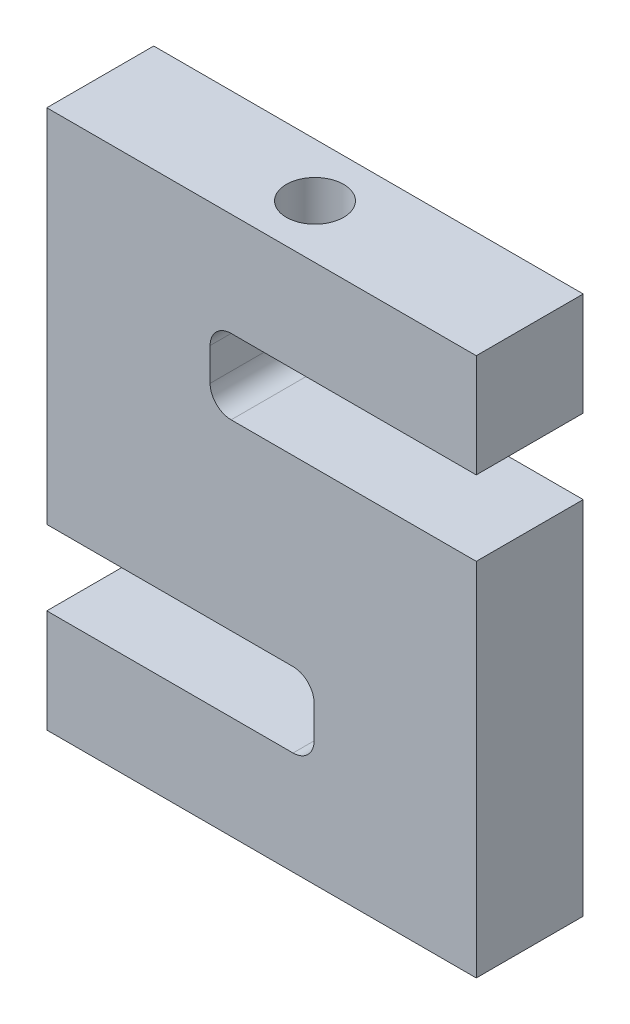
ISO-10303-21;
HEADER;
FILE_DESCRIPTION(('STEP AP214'),'2;1');
FILE_NAME('part.step','',(''),(''),'','','');
FILE_SCHEMA(('AUTOMOTIVE_DESIGN { 1 0 10303 214 1 1 1 1 }'));
ENDSEC;
DATA;
#1=APPLICATION_CONTEXT('core data for automotive mechanical design processes');
#2=APPLICATION_PROTOCOL_DEFINITION('international standard','automotive_design',2000,#1);
#3=PRODUCT_CONTEXT('',#1,'mechanical');
#4=PRODUCT('Part','Part','',(#3));
#5=PRODUCT_RELATED_PRODUCT_CATEGORY('part','',(#4));
#6=PRODUCT_DEFINITION_FORMATION('','',#4);
#7=PRODUCT_DEFINITION_CONTEXT('part definition',#1,'design');
#8=PRODUCT_DEFINITION('design','',#6,#7);
#9=PRODUCT_DEFINITION_SHAPE('','',#8);
#10=(LENGTH_UNIT() NAMED_UNIT(*) SI_UNIT(.MILLI.,.METRE.));
#11=(NAMED_UNIT(*) PLANE_ANGLE_UNIT() SI_UNIT($,.RADIAN.));
#12=(NAMED_UNIT(*) SI_UNIT($,.STERADIAN.) SOLID_ANGLE_UNIT());
#13=UNCERTAINTY_MEASURE_WITH_UNIT(LENGTH_MEASURE(1.E-05),#10,'distance_accuracy_value','');
#14=(GEOMETRIC_REPRESENTATION_CONTEXT(3) GLOBAL_UNCERTAINTY_ASSIGNED_CONTEXT((#13)) GLOBAL_UNIT_ASSIGNED_CONTEXT((#10,
#11,#12)) REPRESENTATION_CONTEXT('',''));
#15=CARTESIAN_POINT('',(0.,0.,0.));
#16=DIRECTION('',(0.,0.,1.));
#17=DIRECTION('',(1.,0.,0.));
#18=AXIS2_PLACEMENT_3D('',#15,#16,#17);
#19=CARTESIAN_POINT('',(3.74241469651418,-17.2389814476984,12.7));
#20=DIRECTION('',(0.,0.,1.));
#21=DIRECTION('',(1.,0.,0.));
#22=AXIS2_PLACEMENT_3D('',#19,#20,#21);
#23=CYLINDRICAL_SURFACE('',#22,2.5);
#24=DIRECTION('',(0.,0.,-1.));
#25=VECTOR('',#24,1.);
#26=CARTESIAN_POINT('',(3.74241469651418,-19.7389814476984,12.7));
#27=LINE('',#26,#25);
#28=CARTESIAN_POINT('',(3.74241469651418,-19.7389814476984,12.7));
#29=VERTEX_POINT('',#28);
#30=CARTESIAN_POINT('',(3.74241469651418,-19.7389814476984,0.));
#31=VERTEX_POINT('',#30);
#32=EDGE_CURVE('E338',#29,#31,#27,.T.);
#33=ORIENTED_EDGE('',*,*,#32,.F.);
#34=CARTESIAN_POINT('',(3.74241469651418,-17.2389814476984,12.7));
#35=DIRECTION('',(0.,0.,-1.));
#36=DIRECTION('',(-1.,0.,0.));
#37=AXIS2_PLACEMENT_3D('',#34,#35,#36);
#38=CIRCLE('',#37,2.5);
#39=CARTESIAN_POINT('',(6.24241469651418,-17.2389814476984,12.7));
#40=VERTEX_POINT('',#39);
#41=EDGE_CURVE('E51',#29,#40,#38,.F.);
#42=ORIENTED_EDGE('',*,*,#41,.T.);
#43=DIRECTION('',(0.,0.,-1.));
#44=VECTOR('',#43,1.);
#45=CARTESIAN_POINT('',(6.24241469651418,-17.2389814476984,12.7));
#46=LINE('',#45,#44);
#47=CARTESIAN_POINT('',(6.24241469651418,-17.2389814476984,0.));
#48=VERTEX_POINT('',#47);
#49=EDGE_CURVE('E342',#48,#40,#46,.F.);
#50=ORIENTED_EDGE('',*,*,#49,.F.);
#51=CARTESIAN_POINT('',(3.74241469651418,-17.2389814476984,0.));
#52=DIRECTION('',(0.,0.,-1.));
#53=DIRECTION('',(-1.,0.,0.));
#54=AXIS2_PLACEMENT_3D('',#51,#52,#53);
#55=CIRCLE('',#54,2.5);
#56=EDGE_CURVE('E11',#48,#31,#55,.T.);
#57=ORIENTED_EDGE('',*,*,#56,.T.);
#58=EDGE_LOOP('',(#33,#42,#50,#57));
#59=FACE_BOUND('',#58,.T.);
#60=ADVANCED_FACE('F43',(#59),#23,.F.);
#61=CARTESIAN_POINT('',(3.74241469651418,-13.3520676357919,12.7));
#62=DIRECTION('',(0.,0.,1.));
#63=DIRECTION('',(1.,0.,0.));
#64=AXIS2_PLACEMENT_3D('',#61,#62,#63);
#65=CYLINDRICAL_SURFACE('',#64,2.5);
#66=DIRECTION('',(0.,0.,-1.));
#67=VECTOR('',#66,1.);
#68=CARTESIAN_POINT('',(6.24241469651418,-13.3520676357919,12.7));
#69=LINE('',#68,#67);
#70=CARTESIAN_POINT('',(6.24241469651418,-13.3520676357919,12.7));
#71=VERTEX_POINT('',#70);
#72=CARTESIAN_POINT('',(6.24241469651418,-13.3520676357919,0.));
#73=VERTEX_POINT('',#72);
#74=EDGE_CURVE('E324',#71,#73,#69,.T.);
#75=ORIENTED_EDGE('',*,*,#74,.F.);
#76=CARTESIAN_POINT('',(3.74241469651418,-13.3520676357919,12.7));
#77=DIRECTION('',(0.,0.,-1.));
#78=DIRECTION('',(-1.,0.,0.));
#79=AXIS2_PLACEMENT_3D('',#76,#77,#78);
#80=CIRCLE('',#79,2.5);
#81=CARTESIAN_POINT('',(3.74241469651418,-10.8520676357919,12.7));
#82=VERTEX_POINT('',#81);
#83=EDGE_CURVE('E332',#71,#82,#80,.F.);
#84=ORIENTED_EDGE('',*,*,#83,.T.);
#85=DIRECTION('',(0.,0.,-1.));
#86=VECTOR('',#85,1.);
#87=CARTESIAN_POINT('',(3.74241469651418,-10.8520676357919,12.7));
#88=LINE('',#87,#86);
#89=CARTESIAN_POINT('',(3.74241469651418,-10.8520676357919,0.));
#90=VERTEX_POINT('',#89);
#91=EDGE_CURVE('E328',#90,#82,#88,.F.);
#92=ORIENTED_EDGE('',*,*,#91,.F.);
#93=CARTESIAN_POINT('',(3.74241469651418,-13.3520676357919,0.));
#94=DIRECTION('',(0.,0.,-1.));
#95=DIRECTION('',(-1.,0.,0.));
#96=AXIS2_PLACEMENT_3D('',#93,#94,#95);
#97=CIRCLE('',#96,2.5);
#98=EDGE_CURVE('E335',#90,#73,#97,.T.);
#99=ORIENTED_EDGE('',*,*,#98,.T.);
#100=EDGE_LOOP('',(#75,#84,#92,#99));
#101=FACE_BOUND('',#100,.T.);
#102=ADVANCED_FACE('F354',(#101),#65,.F.);
#103=CARTESIAN_POINT('',(-3.60618115704416,13.3520676357919,12.7));
#104=DIRECTION('',(0.,0.,1.));
#105=DIRECTION('',(1.,0.,0.));
#106=AXIS2_PLACEMENT_3D('',#103,#104,#105);
#107=CYLINDRICAL_SURFACE('',#106,2.5);
#108=DIRECTION('',(0.,0.,-1.));
#109=VECTOR('',#108,1.);
#110=CARTESIAN_POINT('',(-6.10618115704416,13.3520676357919,12.7));
#111=LINE('',#110,#109);
#112=CARTESIAN_POINT('',(-6.10618115704416,13.3520676357919,12.7));
#113=VERTEX_POINT('',#112);
#114=CARTESIAN_POINT('',(-6.10618115704416,13.3520676357919,0.));
#115=VERTEX_POINT('',#114);
#116=EDGE_CURVE('E310',#113,#115,#111,.T.);
#117=ORIENTED_EDGE('',*,*,#116,.F.);
#118=CARTESIAN_POINT('',(-3.60618115704416,13.3520676357919,12.7));
#119=DIRECTION('',(0.,0.,-1.));
#120=DIRECTION('',(-1.,0.,0.));
#121=AXIS2_PLACEMENT_3D('',#118,#119,#120);
#122=CIRCLE('',#121,2.5);
#123=CARTESIAN_POINT('',(-3.60618115704416,10.8520676357919,12.7));
#124=VERTEX_POINT('',#123);
#125=EDGE_CURVE('E318',#113,#124,#122,.F.);
#126=ORIENTED_EDGE('',*,*,#125,.T.);
#127=DIRECTION('',(0.,0.,-1.));
#128=VECTOR('',#127,1.);
#129=CARTESIAN_POINT('',(-3.60618115704416,10.8520676357919,12.7));
#130=LINE('',#129,#128);
#131=CARTESIAN_POINT('',(-3.60618115704416,10.8520676357919,0.));
#132=VERTEX_POINT('',#131);
#133=EDGE_CURVE('E314',#132,#124,#130,.F.);
#134=ORIENTED_EDGE('',*,*,#133,.F.);
#135=CARTESIAN_POINT('',(-3.60618115704416,13.3520676357919,0.));
#136=DIRECTION('',(0.,0.,-1.));
#137=DIRECTION('',(-1.,0.,0.));
#138=AXIS2_PLACEMENT_3D('',#135,#136,#137);
#139=CIRCLE('',#138,2.5);
#140=EDGE_CURVE('E321',#132,#115,#139,.T.);
#141=ORIENTED_EDGE('',*,*,#140,.T.);
#142=EDGE_LOOP('',(#117,#126,#134,#141));
#143=FACE_BOUND('',#142,.T.);
#144=ADVANCED_FACE('F388',(#143),#107,.F.);
#145=CARTESIAN_POINT('',(-3.60618115704416,17.2389814476984,12.7));
#146=DIRECTION('',(0.,0.,1.));
#147=DIRECTION('',(1.,0.,0.));
#148=AXIS2_PLACEMENT_3D('',#145,#146,#147);
#149=CYLINDRICAL_SURFACE('',#148,2.5);
#150=DIRECTION('',(0.,0.,-1.));
#151=VECTOR('',#150,1.);
#152=CARTESIAN_POINT('',(-3.60618115704416,19.7389814476984,12.7));
#153=LINE('',#152,#151);
#154=CARTESIAN_POINT('',(-3.60618115704416,19.7389814476984,12.7));
#155=VERTEX_POINT('',#154);
#156=CARTESIAN_POINT('',(-3.60618115704416,19.7389814476984,0.));
#157=VERTEX_POINT('',#156);
#158=EDGE_CURVE('E295',#155,#157,#153,.T.);
#159=ORIENTED_EDGE('',*,*,#158,.F.);
#160=CARTESIAN_POINT('',(-3.60618115704416,17.2389814476984,12.7));
#161=DIRECTION('',(0.,0.,-1.));
#162=DIRECTION('',(-1.,0.,0.));
#163=AXIS2_PLACEMENT_3D('',#160,#161,#162);
#164=CIRCLE('',#163,2.5);
#165=CARTESIAN_POINT('',(-6.10618115704416,17.2389814476984,12.7));
#166=VERTEX_POINT('',#165);
#167=EDGE_CURVE('E303',#155,#166,#164,.F.);
#168=ORIENTED_EDGE('',*,*,#167,.T.);
#169=DIRECTION('',(0.,0.,-1.));
#170=VECTOR('',#169,1.);
#171=CARTESIAN_POINT('',(-6.10618115704416,17.2389814476984,12.7));
#172=LINE('',#171,#170);
#173=CARTESIAN_POINT('',(-6.10618115704416,17.2389814476984,0.));
#174=VERTEX_POINT('',#173);
#175=EDGE_CURVE('E299',#174,#166,#172,.F.);
#176=ORIENTED_EDGE('',*,*,#175,.F.);
#177=CARTESIAN_POINT('',(-3.60618115704416,17.2389814476984,0.));
#178=DIRECTION('',(0.,0.,-1.));
#179=DIRECTION('',(-1.,0.,0.));
#180=AXIS2_PLACEMENT_3D('',#177,#178,#179);
#181=CIRCLE('',#180,2.5);
#182=EDGE_CURVE('E307',#174,#157,#181,.T.);
#183=ORIENTED_EDGE('',*,*,#182,.T.);
#184=EDGE_LOOP('',(#159,#168,#176,#183));
#185=FACE_BOUND('',#184,.T.);
#186=ADVANCED_FACE('F382',(#185),#149,.F.);
#187=CARTESIAN_POINT('',(-25.5,32.,12.7));
#188=DIRECTION('',(0.,-1.,0.));
#189=DIRECTION('',(0.,0.,-1.));
#190=AXIS2_PLACEMENT_3D('',#187,#188,#189);
#191=PLANE('',#190);
#192=CARTESIAN_POINT('',(0.,32.,6.35));
#193=DIRECTION('',(0.,1.,0.));
#194=DIRECTION('',(0.,0.,1.));
#195=AXIS2_PLACEMENT_3D('',#192,#193,#194);
#196=CIRCLE('',#195,3.4);
#197=CARTESIAN_POINT('',(0.,32.,9.75));
#198=VERTEX_POINT('',#197);
#199=EDGE_CURVE('E169',#198,#198,#196,.T.);
#200=ORIENTED_EDGE('',*,*,#199,.F.);
#201=EDGE_LOOP('',(#200));
#202=FACE_BOUND('',#201,.T.);
#203=DIRECTION('',(-1.,0.,0.));
#204=VECTOR('',#203,1.);
#205=CARTESIAN_POINT('',(-25.5,32.,0.));
#206=LINE('',#205,#204);
#207=CARTESIAN_POINT('',(25.5,32.,0.));
#208=VERTEX_POINT('',#207);
#209=CARTESIAN_POINT('',(-25.5,32.,0.));
#210=VERTEX_POINT('',#209);
#211=EDGE_CURVE('E183',#208,#210,#206,.T.);
#212=ORIENTED_EDGE('',*,*,#211,.T.);
#213=DIRECTION('',(0.,0.,-1.));
#214=VECTOR('',#213,1.);
#215=CARTESIAN_POINT('',(-25.5,32.,12.7));
#216=LINE('',#215,#214);
#217=CARTESIAN_POINT('',(-25.5,32.,12.7));
#218=VERTEX_POINT('',#217);
#219=EDGE_CURVE('E291',#218,#210,#216,.T.);
#220=ORIENTED_EDGE('',*,*,#219,.F.);
#221=DIRECTION('',(-1.,0.,0.));
#222=VECTOR('',#221,1.);
#223=CARTESIAN_POINT('',(-25.5,32.,12.7));
#224=LINE('',#223,#222);
#225=CARTESIAN_POINT('',(25.5,32.,12.7));
#226=VERTEX_POINT('',#225);
#227=EDGE_CURVE('E184',#226,#218,#224,.T.);
#228=ORIENTED_EDGE('',*,*,#227,.F.);
#229=DIRECTION('',(0.,0.,-1.));
#230=VECTOR('',#229,1.);
#231=CARTESIAN_POINT('',(25.5,32.,12.7));
#232=LINE('',#231,#230);
#233=EDGE_CURVE('E225',#226,#208,#232,.T.);
#234=ORIENTED_EDGE('',*,*,#233,.T.);
#235=EDGE_LOOP('',(#212,#220,#228,#234));
#236=FACE_BOUND('',#235,.T.);
#237=ADVANCED_FACE('F367',(#202,#236),#191,.F.);
#238=CARTESIAN_POINT('',(-25.5,-10.8520676357919,12.7));
#239=DIRECTION('',(1.,0.,0.));
#240=DIRECTION('',(0.,0.,-1.));
#241=AXIS2_PLACEMENT_3D('',#238,#239,#240);
#242=PLANE('',#241);
#243=DIRECTION('',(0.,-1.,0.));
#244=VECTOR('',#243,1.);
#245=CARTESIAN_POINT('',(-25.5,-10.8520676357919,0.));
#246=LINE('',#245,#244);
#247=CARTESIAN_POINT('',(-25.5,-10.8520676357919,0.));
#248=VERTEX_POINT('',#247);
#249=EDGE_CURVE('E229',#210,#248,#246,.T.);
#250=ORIENTED_EDGE('',*,*,#249,.T.);
#251=DIRECTION('',(0.,0.,-1.));
#252=VECTOR('',#251,1.);
#253=CARTESIAN_POINT('',(-25.5,-10.8520676357919,12.7));
#254=LINE('',#253,#252);
#255=CARTESIAN_POINT('',(-25.5,-10.8520676357919,12.7));
#256=VERTEX_POINT('',#255);
#257=EDGE_CURVE('E287',#256,#248,#254,.T.);
#258=ORIENTED_EDGE('',*,*,#257,.F.);
#259=DIRECTION('',(0.,-1.,0.));
#260=VECTOR('',#259,1.);
#261=CARTESIAN_POINT('',(-25.5,-10.8520676357919,12.7));
#262=LINE('',#261,#260);
#263=EDGE_CURVE('E188',#218,#256,#262,.T.);
#264=ORIENTED_EDGE('',*,*,#263,.F.);
#265=ORIENTED_EDGE('',*,*,#219,.T.);
#266=EDGE_LOOP('',(#250,#258,#264,#265));
#267=FACE_BOUND('',#266,.T.);
#268=ADVANCED_FACE('F362',(#267),#242,.F.);
#269=CARTESIAN_POINT('',(6.24241469651418,-10.8520676357919,12.7));
#270=DIRECTION('',(0.,1.,0.));
#271=DIRECTION('',(-1.,0.,0.));
#272=AXIS2_PLACEMENT_3D('',#269,#270,#271);
#273=PLANE('',#272);
#274=DIRECTION('',(1.,0.,0.));
#275=VECTOR('',#274,1.);
#276=CARTESIAN_POINT('',(6.24241469651418,-10.8520676357919,0.));
#277=LINE('',#276,#275);
#278=EDGE_CURVE('E232',#248,#90,#277,.T.);
#279=ORIENTED_EDGE('',*,*,#278,.T.);
#280=ORIENTED_EDGE('',*,*,#91,.T.);
#281=DIRECTION('',(1.,0.,0.));
#282=VECTOR('',#281,1.);
#283=CARTESIAN_POINT('',(6.24241469651418,-10.8520676357919,12.7));
#284=LINE('',#283,#282);
#285=EDGE_CURVE('E192',#256,#82,#284,.T.);
#286=ORIENTED_EDGE('',*,*,#285,.F.);
#287=ORIENTED_EDGE('',*,*,#257,.T.);
#288=EDGE_LOOP('',(#279,#280,#286,#287));
#289=FACE_BOUND('',#288,.T.);
#290=ADVANCED_FACE('F359',(#289),#273,.F.);
#291=CARTESIAN_POINT('',(6.24241469651418,-19.7389814476984,12.7));
#292=DIRECTION('',(1.,0.,0.));
#293=DIRECTION('',(0.,0.,-1.));
#294=AXIS2_PLACEMENT_3D('',#291,#292,#293);
#295=PLANE('',#294);
#296=DIRECTION('',(0.,-1.,0.));
#297=VECTOR('',#296,1.);
#298=CARTESIAN_POINT('',(6.24241469651418,-19.7389814476984,0.));
#299=LINE('',#298,#297);
#300=EDGE_CURVE('E236',#73,#48,#299,.T.);
#301=ORIENTED_EDGE('',*,*,#300,.T.);
#302=ORIENTED_EDGE('',*,*,#49,.T.);
#303=DIRECTION('',(0.,-1.,0.));
#304=VECTOR('',#303,1.);
#305=CARTESIAN_POINT('',(6.24241469651418,-19.7389814476984,12.7));
#306=LINE('',#305,#304);
#307=EDGE_CURVE('E196',#71,#40,#306,.T.);
#308=ORIENTED_EDGE('',*,*,#307,.F.);
#309=ORIENTED_EDGE('',*,*,#74,.T.);
#310=EDGE_LOOP('',(#301,#302,#308,#309));
#311=FACE_BOUND('',#310,.T.);
#312=ADVANCED_FACE('F347',(#311),#295,.F.);
#313=CARTESIAN_POINT('',(-25.5,-19.7389814476984,12.7));
#314=DIRECTION('',(0.,-1.,0.));
#315=DIRECTION('',(0.,0.,-1.));
#316=AXIS2_PLACEMENT_3D('',#313,#314,#315);
#317=PLANE('',#316);
#318=DIRECTION('',(-1.,0.,0.));
#319=VECTOR('',#318,1.);
#320=CARTESIAN_POINT('',(-25.5,-19.7389814476984,12.7));
#321=LINE('',#320,#319);
#322=CARTESIAN_POINT('',(-25.5,-19.7389814476984,12.7));
#323=VERTEX_POINT('',#322);
#324=EDGE_CURVE('E200',#29,#323,#321,.T.);
#325=ORIENTED_EDGE('',*,*,#324,.F.);
#326=ORIENTED_EDGE('',*,*,#32,.T.);
#327=DIRECTION('',(-1.,0.,0.));
#328=VECTOR('',#327,1.);
#329=CARTESIAN_POINT('',(-25.5,-19.7389814476984,0.));
#330=LINE('',#329,#328);
#331=CARTESIAN_POINT('',(-25.5,-19.7389814476984,0.));
#332=VERTEX_POINT('',#331);
#333=EDGE_CURVE('E240',#31,#332,#330,.T.);
#334=ORIENTED_EDGE('',*,*,#333,.T.);
#335=DIRECTION('',(0.,0.,-1.));
#336=VECTOR('',#335,1.);
#337=CARTESIAN_POINT('',(-25.5,-19.7389814476984,12.7));
#338=LINE('',#337,#336);
#339=EDGE_CURVE('E283',#323,#332,#338,.T.);
#340=ORIENTED_EDGE('',*,*,#339,.F.);
#341=EDGE_LOOP('',(#325,#326,#334,#340));
#342=FACE_BOUND('',#341,.T.);
#343=ADVANCED_FACE('F412',(#342),#317,.F.);
#344=CARTESIAN_POINT('',(-25.5,-32.,12.7));
#345=DIRECTION('',(1.,0.,0.));
#346=DIRECTION('',(0.,0.,-1.));
#347=AXIS2_PLACEMENT_3D('',#344,#345,#346);
#348=PLANE('',#347);
#349=DIRECTION('',(0.,-1.,0.));
#350=VECTOR('',#349,1.);
#351=CARTESIAN_POINT('',(-25.5,-32.,0.));
#352=LINE('',#351,#350);
#353=CARTESIAN_POINT('',(-25.5,-32.,0.));
#354=VERTEX_POINT('',#353);
#355=EDGE_CURVE('E243',#332,#354,#352,.T.);
#356=ORIENTED_EDGE('',*,*,#355,.T.);
#357=DIRECTION('',(0.,0.,-1.));
#358=VECTOR('',#357,1.);
#359=CARTESIAN_POINT('',(-25.5,-32.,12.7));
#360=LINE('',#359,#358);
#361=CARTESIAN_POINT('',(-25.5,-32.,12.7));
#362=VERTEX_POINT('',#361);
#363=EDGE_CURVE('E279',#362,#354,#360,.T.);
#364=ORIENTED_EDGE('',*,*,#363,.F.);
#365=DIRECTION('',(0.,-1.,0.));
#366=VECTOR('',#365,1.);
#367=CARTESIAN_POINT('',(-25.5,-32.,12.7));
#368=LINE('',#367,#366);
#369=EDGE_CURVE('E203',#323,#362,#368,.T.);
#370=ORIENTED_EDGE('',*,*,#369,.F.);
#371=ORIENTED_EDGE('',*,*,#339,.T.);
#372=EDGE_LOOP('',(#356,#364,#370,#371));
#373=FACE_BOUND('',#372,.T.);
#374=ADVANCED_FACE('F407',(#373),#348,.F.);
#375=CARTESIAN_POINT('',(25.5,-32.,12.7));
#376=DIRECTION('',(0.,1.,0.));
#377=DIRECTION('',(-1.,0.,0.));
#378=AXIS2_PLACEMENT_3D('',#375,#376,#377);
#379=PLANE('',#378);
#380=CARTESIAN_POINT('',(0.,-32.,6.35));
#381=DIRECTION('',(0.,-1.,0.));
#382=DIRECTION('',(0.,0.,-1.));
#383=AXIS2_PLACEMENT_3D('',#380,#381,#382);
#384=CIRCLE('',#383,3.39999999999999);
#385=CARTESIAN_POINT('',(0.,-32.,2.95000000000001));
#386=VERTEX_POINT('',#385);
#387=EDGE_CURVE('E170',#386,#386,#384,.T.);
#388=ORIENTED_EDGE('',*,*,#387,.F.);
#389=EDGE_LOOP('',(#388));
#390=FACE_BOUND('',#389,.T.);
#391=DIRECTION('',(1.,0.,0.));
#392=VECTOR('',#391,1.);
#393=CARTESIAN_POINT('',(25.5,-32.,0.));
#394=LINE('',#393,#392);
#395=CARTESIAN_POINT('',(25.5,-32.,0.));
#396=VERTEX_POINT('',#395);
#397=EDGE_CURVE('E246',#354,#396,#394,.T.);
#398=ORIENTED_EDGE('',*,*,#397,.T.);
#399=DIRECTION('',(0.,0.,-1.));
#400=VECTOR('',#399,1.);
#401=CARTESIAN_POINT('',(25.5,-32.,12.7));
#402=LINE('',#401,#400);
#403=CARTESIAN_POINT('',(25.5,-32.,12.7));
#404=VERTEX_POINT('',#403);
#405=EDGE_CURVE('E275',#404,#396,#402,.T.);
#406=ORIENTED_EDGE('',*,*,#405,.F.);
#407=DIRECTION('',(1.,0.,0.));
#408=VECTOR('',#407,1.);
#409=CARTESIAN_POINT('',(25.5,-32.,12.7));
#410=LINE('',#409,#408);
#411=EDGE_CURVE('E206',#362,#404,#410,.T.);
#412=ORIENTED_EDGE('',*,*,#411,.F.);
#413=ORIENTED_EDGE('',*,*,#363,.T.);
#414=EDGE_LOOP('',(#398,#406,#412,#413));
#415=FACE_BOUND('',#414,.T.);
#416=ADVANCED_FACE('F403',(#390,#415),#379,.F.);
#417=CARTESIAN_POINT('',(25.5,10.8520676357919,12.7));
#418=DIRECTION('',(-1.,0.,0.));
#419=DIRECTION('',(0.,-1.,0.));
#420=AXIS2_PLACEMENT_3D('',#417,#418,#419);
#421=PLANE('',#420);
#422=DIRECTION('',(0.,1.,0.));
#423=VECTOR('',#422,1.);
#424=CARTESIAN_POINT('',(25.5,10.8520676357919,0.));
#425=LINE('',#424,#423);
#426=CARTESIAN_POINT('',(25.5,10.8520676357919,0.));
#427=VERTEX_POINT('',#426);
#428=EDGE_CURVE('E249',#396,#427,#425,.T.);
#429=ORIENTED_EDGE('',*,*,#428,.T.);
#430=DIRECTION('',(0.,0.,-1.));
#431=VECTOR('',#430,1.);
#432=CARTESIAN_POINT('',(25.5,10.8520676357919,12.7));
#433=LINE('',#432,#431);
#434=CARTESIAN_POINT('',(25.5,10.8520676357919,12.7));
#435=VERTEX_POINT('',#434);
#436=EDGE_CURVE('E271',#435,#427,#433,.T.);
#437=ORIENTED_EDGE('',*,*,#436,.F.);
#438=DIRECTION('',(0.,1.,0.));
#439=VECTOR('',#438,1.);
#440=CARTESIAN_POINT('',(25.5,10.8520676357919,12.7));
#441=LINE('',#440,#439);
#442=EDGE_CURVE('E209',#404,#435,#441,.T.);
#443=ORIENTED_EDGE('',*,*,#442,.F.);
#444=ORIENTED_EDGE('',*,*,#405,.T.);
#445=EDGE_LOOP('',(#429,#437,#443,#444));
#446=FACE_BOUND('',#445,.T.);
#447=ADVANCED_FACE('F399',(#446),#421,.F.);
#448=CARTESIAN_POINT('',(-6.10618115704416,10.8520676357919,12.7));
#449=DIRECTION('',(0.,-1.,0.));
#450=DIRECTION('',(0.,0.,-1.));
#451=AXIS2_PLACEMENT_3D('',#448,#449,#450);
#452=PLANE('',#451);
#453=DIRECTION('',(-1.,0.,0.));
#454=VECTOR('',#453,1.);
#455=CARTESIAN_POINT('',(-6.10618115704416,10.8520676357919,0.));
#456=LINE('',#455,#454);
#457=EDGE_CURVE('E252',#427,#132,#456,.T.);
#458=ORIENTED_EDGE('',*,*,#457,.T.);
#459=ORIENTED_EDGE('',*,*,#133,.T.);
#460=DIRECTION('',(-1.,0.,0.));
#461=VECTOR('',#460,1.);
#462=CARTESIAN_POINT('',(-6.10618115704416,10.8520676357919,12.7));
#463=LINE('',#462,#461);
#464=EDGE_CURVE('E212',#435,#124,#463,.T.);
#465=ORIENTED_EDGE('',*,*,#464,.F.);
#466=ORIENTED_EDGE('',*,*,#436,.T.);
#467=EDGE_LOOP('',(#458,#459,#465,#466));
#468=FACE_BOUND('',#467,.T.);
#469=ADVANCED_FACE('F394',(#468),#452,.F.);
#470=CARTESIAN_POINT('',(-6.10618115704416,19.7389814476984,12.7));
#471=DIRECTION('',(-1.,0.,0.));
#472=DIRECTION('',(0.,-1.,0.));
#473=AXIS2_PLACEMENT_3D('',#470,#471,#472);
#474=PLANE('',#473);
#475=DIRECTION('',(0.,1.,0.));
#476=VECTOR('',#475,1.);
#477=CARTESIAN_POINT('',(-6.10618115704416,19.7389814476984,12.7));
#478=LINE('',#477,#476);
#479=EDGE_CURVE('E216',#113,#166,#478,.T.);
#480=ORIENTED_EDGE('',*,*,#479,.F.);
#481=ORIENTED_EDGE('',*,*,#116,.T.);
#482=DIRECTION('',(0.,1.,0.));
#483=VECTOR('',#482,1.);
#484=CARTESIAN_POINT('',(-6.10618115704416,19.7389814476984,0.));
#485=LINE('',#484,#483);
#486=EDGE_CURVE('E256',#115,#174,#485,.T.);
#487=ORIENTED_EDGE('',*,*,#486,.T.);
#488=ORIENTED_EDGE('',*,*,#175,.T.);
#489=EDGE_LOOP('',(#480,#481,#487,#488));
#490=FACE_BOUND('',#489,.T.);
#491=ADVANCED_FACE('F385',(#490),#474,.F.);
#492=CARTESIAN_POINT('',(25.5,19.7389814476984,12.7));
#493=DIRECTION('',(0.,1.,0.));
#494=DIRECTION('',(-1.,0.,0.));
#495=AXIS2_PLACEMENT_3D('',#492,#493,#494);
#496=PLANE('',#495);
#497=DIRECTION('',(1.,0.,0.));
#498=VECTOR('',#497,1.);
#499=CARTESIAN_POINT('',(25.5,19.7389814476984,12.7));
#500=LINE('',#499,#498);
#501=CARTESIAN_POINT('',(25.5,19.7389814476984,12.7));
#502=VERTEX_POINT('',#501);
#503=EDGE_CURVE('E219',#155,#502,#500,.T.);
#504=ORIENTED_EDGE('',*,*,#503,.F.);
#505=ORIENTED_EDGE('',*,*,#158,.T.);
#506=DIRECTION('',(1.,0.,0.));
#507=VECTOR('',#506,1.);
#508=CARTESIAN_POINT('',(25.5,19.7389814476984,0.));
#509=LINE('',#508,#507);
#510=CARTESIAN_POINT('',(25.5,19.7389814476984,0.));
#511=VERTEX_POINT('',#510);
#512=EDGE_CURVE('E259',#157,#511,#509,.T.);
#513=ORIENTED_EDGE('',*,*,#512,.T.);
#514=DIRECTION('',(0.,0.,-1.));
#515=VECTOR('',#514,1.);
#516=CARTESIAN_POINT('',(25.5,19.7389814476984,12.7));
#517=LINE('',#516,#515);
#518=EDGE_CURVE('E267',#502,#511,#517,.T.);
#519=ORIENTED_EDGE('',*,*,#518,.F.);
#520=EDGE_LOOP('',(#504,#505,#513,#519));
#521=FACE_BOUND('',#520,.T.);
#522=ADVANCED_FACE('F376',(#521),#496,.F.);
#523=CARTESIAN_POINT('',(25.5,32.,12.7));
#524=DIRECTION('',(-1.,0.,0.));
#525=DIRECTION('',(0.,-1.,0.));
#526=AXIS2_PLACEMENT_3D('',#523,#524,#525);
#527=PLANE('',#526);
#528=DIRECTION('',(0.,1.,0.));
#529=VECTOR('',#528,1.);
#530=CARTESIAN_POINT('',(25.5,32.,0.));
#531=LINE('',#530,#529);
#532=EDGE_CURVE('E189',#511,#208,#531,.T.);
#533=ORIENTED_EDGE('',*,*,#532,.T.);
#534=ORIENTED_EDGE('',*,*,#233,.F.);
#535=DIRECTION('',(0.,1.,0.));
#536=VECTOR('',#535,1.);
#537=CARTESIAN_POINT('',(25.5,32.,12.7));
#538=LINE('',#537,#536);
#539=EDGE_CURVE('E222',#502,#226,#538,.T.);
#540=ORIENTED_EDGE('',*,*,#539,.F.);
#541=ORIENTED_EDGE('',*,*,#518,.T.);
#542=EDGE_LOOP('',(#533,#534,#540,#541));
#543=FACE_BOUND('',#542,.T.);
#544=ADVANCED_FACE('F372',(#543),#527,.F.);
#545=CARTESIAN_POINT('',(0.,0.,12.7));
#546=DIRECTION('',(0.,0.,-1.));
#547=DIRECTION('',(-1.,0.,0.));
#548=AXIS2_PLACEMENT_3D('',#545,#546,#547);
#549=PLANE('',#548);
#550=ORIENTED_EDGE('',*,*,#41,.F.);
#551=ORIENTED_EDGE('',*,*,#324,.T.);
#552=ORIENTED_EDGE('',*,*,#369,.T.);
#553=ORIENTED_EDGE('',*,*,#411,.T.);
#554=ORIENTED_EDGE('',*,*,#442,.T.);
#555=ORIENTED_EDGE('',*,*,#464,.T.);
#556=ORIENTED_EDGE('',*,*,#125,.F.);
#557=ORIENTED_EDGE('',*,*,#479,.T.);
#558=ORIENTED_EDGE('',*,*,#167,.F.);
#559=ORIENTED_EDGE('',*,*,#503,.T.);
#560=ORIENTED_EDGE('',*,*,#539,.T.);
#561=ORIENTED_EDGE('',*,*,#227,.T.);
#562=ORIENTED_EDGE('',*,*,#263,.T.);
#563=ORIENTED_EDGE('',*,*,#285,.T.);
#564=ORIENTED_EDGE('',*,*,#83,.F.);
#565=ORIENTED_EDGE('',*,*,#307,.T.);
#566=EDGE_LOOP('',(#550,#551,#552,#553,#554,#555,#556,#557,#558,#559,#560,#561,#562,#563,#564,#565));
#567=FACE_BOUND('',#566,.T.);
#568=ADVANCED_FACE('F349',(#567),#549,.F.);
#569=CARTESIAN_POINT('',(0.,0.,0.));
#570=DIRECTION('',(0.,0.,-1.));
#571=DIRECTION('',(-1.,0.,0.));
#572=AXIS2_PLACEMENT_3D('',#569,#570,#571);
#573=PLANE('',#572);
#574=ORIENTED_EDGE('',*,*,#211,.F.);
#575=ORIENTED_EDGE('',*,*,#532,.F.);
#576=ORIENTED_EDGE('',*,*,#512,.F.);
#577=ORIENTED_EDGE('',*,*,#182,.F.);
#578=ORIENTED_EDGE('',*,*,#486,.F.);
#579=ORIENTED_EDGE('',*,*,#140,.F.);
#580=ORIENTED_EDGE('',*,*,#457,.F.);
#581=ORIENTED_EDGE('',*,*,#428,.F.);
#582=ORIENTED_EDGE('',*,*,#397,.F.);
#583=ORIENTED_EDGE('',*,*,#355,.F.);
#584=ORIENTED_EDGE('',*,*,#333,.F.);
#585=ORIENTED_EDGE('',*,*,#56,.F.);
#586=ORIENTED_EDGE('',*,*,#300,.F.);
#587=ORIENTED_EDGE('',*,*,#98,.F.);
#588=ORIENTED_EDGE('',*,*,#278,.F.);
#589=ORIENTED_EDGE('',*,*,#249,.F.);
#590=EDGE_LOOP('',(#574,#575,#576,#577,#578,#579,#580,#581,#582,#583,#584,#585,#586,#587,#588,#589));
#591=FACE_BOUND('',#590,.T.);
#592=ADVANCED_FACE('F356',(#591),#573,.T.);
#593=CARTESIAN_POINT('',(0.,22.8520676357919,6.35));
#594=DIRECTION('',(0.,1.,0.));
#595=DIRECTION('',(0.,0.,1.));
#596=AXIS2_PLACEMENT_3D('',#593,#594,#595);
#597=CONICAL_SURFACE('',#596,3.4,1.02974425867665);
#598=CARTESIAN_POINT('',(0.,20.8091415310982,6.35));
#599=VERTEX_POINT('',#598);
#600=VERTEX_LOOP('',#599);
#601=FACE_BOUND('',#600,.T.);
#602=CARTESIAN_POINT('',(0.,22.8520676357919,6.35));
#603=DIRECTION('',(0.,1.,0.));
#604=DIRECTION('',(0.,0.,1.));
#605=AXIS2_PLACEMENT_3D('',#602,#603,#604);
#606=CIRCLE('',#605,3.4);
#607=CARTESIAN_POINT('',(0.,22.8520676357919,9.75));
#608=VERTEX_POINT('',#607);
#609=EDGE_CURVE('E175',#608,#608,#606,.T.);
#610=ORIENTED_EDGE('',*,*,#609,.T.);
#611=EDGE_LOOP('',(#610));
#612=FACE_BOUND('',#611,.T.);
#613=ADVANCED_FACE('F452',(#601,#612),#597,.F.);
#614=CARTESIAN_POINT('',(0.,32.,6.35));
#615=DIRECTION('',(0.,1.,0.));
#616=DIRECTION('',(0.,0.,1.));
#617=AXIS2_PLACEMENT_3D('',#614,#615,#616);
#618=CYLINDRICAL_SURFACE('',#617,3.4);
#619=ORIENTED_EDGE('',*,*,#609,.F.);
#620=EDGE_LOOP('',(#619));
#621=FACE_BOUND('',#620,.T.);
#622=ORIENTED_EDGE('',*,*,#199,.T.);
#623=EDGE_LOOP('',(#622));
#624=FACE_BOUND('',#623,.T.);
#625=ADVANCED_FACE('F162',(#621,#624),#618,.F.);
#626=CARTESIAN_POINT('',(0.,-22.8520676357919,6.35));
#627=DIRECTION('',(0.,-1.,0.));
#628=DIRECTION('',(0.,0.,-1.));
#629=AXIS2_PLACEMENT_3D('',#626,#627,#628);
#630=CONICAL_SURFACE('',#629,3.4,1.02974425867665);
#631=CARTESIAN_POINT('',(0.,-20.8091415310982,6.35));
#632=VERTEX_POINT('',#631);
#633=VERTEX_LOOP('',#632);
#634=FACE_BOUND('',#633,.T.);
#635=CARTESIAN_POINT('',(0.,-22.8520676357919,6.35));
#636=DIRECTION('',(0.,-1.,0.));
#637=DIRECTION('',(0.,0.,-1.));
#638=AXIS2_PLACEMENT_3D('',#635,#636,#637);
#639=CIRCLE('',#638,3.4);
#640=CARTESIAN_POINT('',(0.,-22.8520676357919,2.95));
#641=VERTEX_POINT('',#640);
#642=EDGE_CURVE('E166',#641,#641,#639,.T.);
#643=ORIENTED_EDGE('',*,*,#642,.T.);
#644=EDGE_LOOP('',(#643));
#645=FACE_BOUND('',#644,.T.);
#646=ADVANCED_FACE('F158',(#634,#645),#630,.F.);
#647=CARTESIAN_POINT('',(0.,-32.,6.35));
#648=DIRECTION('',(0.,-1.,0.));
#649=DIRECTION('',(0.,0.,-1.));
#650=AXIS2_PLACEMENT_3D('',#647,#648,#649);
#651=CYLINDRICAL_SURFACE('',#650,3.39999999999999);
#652=ORIENTED_EDGE('',*,*,#642,.F.);
#653=EDGE_LOOP('',(#652));
#654=FACE_BOUND('',#653,.T.);
#655=ORIENTED_EDGE('',*,*,#387,.T.);
#656=EDGE_LOOP('',(#655));
#657=FACE_BOUND('',#656,.T.);
#658=ADVANCED_FACE('F161',(#654,#657),#651,.F.);
#659=CLOSED_SHELL('',(#60,#102,#144,#186,#237,#268,#290,#312,#343,#374,#416,#447,#469,#491,#522,
#544,#568,#592,#613,#625,#646,#658));
#660=MANIFOLD_SOLID_BREP('B2',#659);
#661=ADVANCED_BREP_SHAPE_REPRESENTATION('',(#18,#660),#14);
#662=SHAPE_DEFINITION_REPRESENTATION(#9,#661);
ENDSEC;
END-ISO-10303-21;
